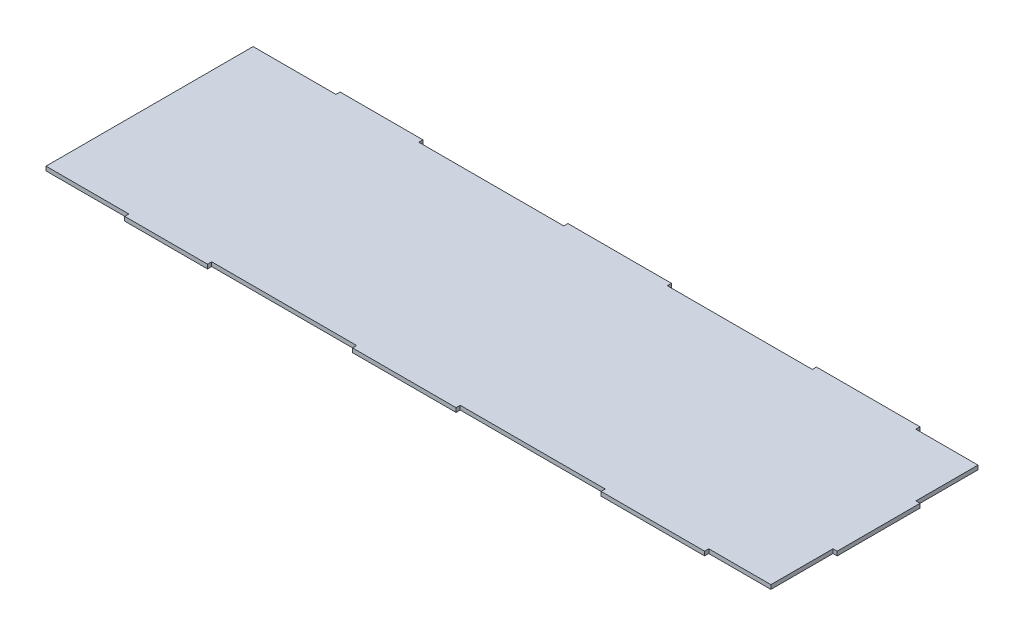
ISO-10303-21;
HEADER;
FILE_DESCRIPTION(('STEP AP214'),'2;1');
FILE_NAME('part.step','',(''),(''),'','','');
FILE_SCHEMA(('AUTOMOTIVE_DESIGN { 1 0 10303 214 1 1 1 1 }'));
ENDSEC;
DATA;
#1=APPLICATION_CONTEXT('core data for automotive mechanical design processes');
#2=APPLICATION_PROTOCOL_DEFINITION('international standard','automotive_design',2000,#1);
#3=PRODUCT_CONTEXT('',#1,'mechanical');
#4=PRODUCT('Part','Part','',(#3));
#5=PRODUCT_RELATED_PRODUCT_CATEGORY('part','',(#4));
#6=PRODUCT_DEFINITION_FORMATION('','',#4);
#7=PRODUCT_DEFINITION_CONTEXT('part definition',#1,'design');
#8=PRODUCT_DEFINITION('design','',#6,#7);
#9=PRODUCT_DEFINITION_SHAPE('','',#8);
#10=(LENGTH_UNIT() NAMED_UNIT(*) SI_UNIT(.MILLI.,.METRE.));
#11=(NAMED_UNIT(*) PLANE_ANGLE_UNIT() SI_UNIT($,.RADIAN.));
#12=(NAMED_UNIT(*) SI_UNIT($,.STERADIAN.) SOLID_ANGLE_UNIT());
#13=UNCERTAINTY_MEASURE_WITH_UNIT(LENGTH_MEASURE(1.E-05),#10,'distance_accuracy_value','');
#14=(GEOMETRIC_REPRESENTATION_CONTEXT(3) GLOBAL_UNCERTAINTY_ASSIGNED_CONTEXT((#13)) GLOBAL_UNIT_ASSIGNED_CONTEXT((#10,
#11,#12)) REPRESENTATION_CONTEXT('',''));
#15=CARTESIAN_POINT('',(0.,0.,0.));
#16=DIRECTION('',(0.,0.,1.));
#17=DIRECTION('',(1.,0.,0.));
#18=AXIS2_PLACEMENT_3D('',#15,#16,#17);
#19=CARTESIAN_POINT('',(350.,2.,0.));
#20=DIRECTION('',(1.,0.,0.));
#21=DIRECTION('',(0.,0.,-1.));
#22=AXIS2_PLACEMENT_3D('',#19,#20,#21);
#23=PLANE('',#22);
#24=DIRECTION('',(0.,0.,1.));
#25=VECTOR('',#24,1.);
#26=CARTESIAN_POINT('',(350.,2.,0.));
#27=LINE('',#26,#25);
#28=CARTESIAN_POINT('',(350.,2.,-50.));
#29=VERTEX_POINT('',#28);
#30=CARTESIAN_POINT('',(350.,2.,-20.));
#31=VERTEX_POINT('',#30);
#32=EDGE_CURVE('E508',#29,#31,#27,.T.);
#33=ORIENTED_EDGE('',*,*,#32,.T.);
#34=DIRECTION('',(0.,-1.,0.));
#35=VECTOR('',#34,1.);
#36=CARTESIAN_POINT('',(350.,2.,-20.));
#37=LINE('',#36,#35);
#38=CARTESIAN_POINT('',(350.,0.,-20.));
#39=VERTEX_POINT('',#38);
#40=EDGE_CURVE('E507',#31,#39,#37,.T.);
#41=ORIENTED_EDGE('',*,*,#40,.T.);
#42=DIRECTION('',(0.,0.,1.));
#43=VECTOR('',#42,1.);
#44=CARTESIAN_POINT('',(350.,0.,0.));
#45=LINE('',#44,#43);
#46=CARTESIAN_POINT('',(350.,0.,-50.));
#47=VERTEX_POINT('',#46);
#48=EDGE_CURVE('E361',#47,#39,#45,.T.);
#49=ORIENTED_EDGE('',*,*,#48,.F.);
#50=DIRECTION('',(0.,-1.,0.));
#51=VECTOR('',#50,1.);
#52=CARTESIAN_POINT('',(350.,2.,-50.));
#53=LINE('',#52,#51);
#54=EDGE_CURVE('E409',#29,#47,#53,.T.);
#55=ORIENTED_EDGE('',*,*,#54,.F.);
#56=EDGE_LOOP('',(#33,#41,#49,#55));
#57=FACE_BOUND('',#56,.T.);
#58=ADVANCED_FACE('F68',(#57),#23,.T.);
#59=CARTESIAN_POINT('',(80.,2.,0.));
#60=DIRECTION('',(1.,0.,0.));
#61=DIRECTION('',(0.,0.,-1.));
#62=AXIS2_PLACEMENT_3D('',#59,#60,#61);
#63=PLANE('',#62);
#64=DIRECTION('',(0.,0.,1.));
#65=VECTOR('',#64,1.);
#66=CARTESIAN_POINT('',(80.,0.,0.));
#67=LINE('',#66,#65);
#68=CARTESIAN_POINT('',(80.,0.,-52.));
#69=VERTEX_POINT('',#68);
#70=CARTESIAN_POINT('',(80.,0.,-50.));
#71=VERTEX_POINT('',#70);
#72=EDGE_CURVE('E301',#69,#71,#67,.T.);
#73=ORIENTED_EDGE('',*,*,#72,.F.);
#74=DIRECTION('',(0.,-1.,0.));
#75=VECTOR('',#74,1.);
#76=CARTESIAN_POINT('',(80.,2.,-52.));
#77=LINE('',#76,#75);
#78=CARTESIAN_POINT('',(80.,2.,-52.));
#79=VERTEX_POINT('',#78);
#80=EDGE_CURVE('E12',#79,#69,#77,.T.);
#81=ORIENTED_EDGE('',*,*,#80,.F.);
#82=DIRECTION('',(0.,0.,1.));
#83=VECTOR('',#82,1.);
#84=CARTESIAN_POINT('',(80.,2.,0.));
#85=LINE('',#84,#83);
#86=CARTESIAN_POINT('',(80.,2.,-50.));
#87=VERTEX_POINT('',#86);
#88=EDGE_CURVE('E487',#79,#87,#85,.T.);
#89=ORIENTED_EDGE('',*,*,#88,.T.);
#90=DIRECTION('',(0.,-1.,0.));
#91=VECTOR('',#90,1.);
#92=CARTESIAN_POINT('',(80.,2.,-50.));
#93=LINE('',#92,#91);
#94=EDGE_CURVE('E93',#87,#71,#93,.T.);
#95=ORIENTED_EDGE('',*,*,#94,.T.);
#96=EDGE_LOOP('',(#73,#81,#89,#95));
#97=FACE_BOUND('',#96,.T.);
#98=ADVANCED_FACE('F70',(#97),#63,.T.);
#99=CARTESIAN_POINT('',(0.,2.,-52.));
#100=DIRECTION('',(0.,0.,-1.));
#101=DIRECTION('',(-1.,0.,0.));
#102=AXIS2_PLACEMENT_3D('',#99,#100,#101);
#103=PLANE('',#102);
#104=DIRECTION('',(1.,0.,0.));
#105=VECTOR('',#104,1.);
#106=CARTESIAN_POINT('',(0.,0.,-52.));
#107=LINE('',#106,#105);
#108=CARTESIAN_POINT('',(40.,0.,-52.));
#109=VERTEX_POINT('',#108);
#110=EDGE_CURVE('E304',#109,#69,#107,.T.);
#111=ORIENTED_EDGE('',*,*,#110,.F.);
#112=DIRECTION('',(0.,-1.,0.));
#113=VECTOR('',#112,1.);
#114=CARTESIAN_POINT('',(40.,2.,-52.));
#115=LINE('',#114,#113);
#116=CARTESIAN_POINT('',(40.,2.,-52.));
#117=VERTEX_POINT('',#116);
#118=EDGE_CURVE('E77',#117,#109,#115,.T.);
#119=ORIENTED_EDGE('',*,*,#118,.F.);
#120=DIRECTION('',(1.,0.,0.));
#121=VECTOR('',#120,1.);
#122=CARTESIAN_POINT('',(0.,2.,-52.));
#123=LINE('',#122,#121);
#124=EDGE_CURVE('E483',#117,#79,#123,.T.);
#125=ORIENTED_EDGE('',*,*,#124,.T.);
#126=ORIENTED_EDGE('',*,*,#80,.T.);
#127=EDGE_LOOP('',(#111,#119,#125,#126));
#128=FACE_BOUND('',#127,.T.);
#129=ADVANCED_FACE('F482',(#128),#103,.T.);
#130=CARTESIAN_POINT('',(40.,2.,0.));
#131=DIRECTION('',(1.,0.,0.));
#132=DIRECTION('',(0.,0.,-1.));
#133=AXIS2_PLACEMENT_3D('',#130,#131,#132);
#134=PLANE('',#133);
#135=DIRECTION('',(0.,0.,1.));
#136=VECTOR('',#135,1.);
#137=CARTESIAN_POINT('',(40.,0.,0.));
#138=LINE('',#137,#136);
#139=CARTESIAN_POINT('',(40.,0.,-50.));
#140=VERTEX_POINT('',#139);
#141=EDGE_CURVE('E309',#109,#140,#138,.T.);
#142=ORIENTED_EDGE('',*,*,#141,.T.);
#143=DIRECTION('',(0.,-1.,0.));
#144=VECTOR('',#143,1.);
#145=CARTESIAN_POINT('',(40.,2.,-50.));
#146=LINE('',#145,#144);
#147=CARTESIAN_POINT('',(40.,2.,-50.));
#148=VERTEX_POINT('',#147);
#149=EDGE_CURVE('E465',#148,#140,#146,.T.);
#150=ORIENTED_EDGE('',*,*,#149,.F.);
#151=DIRECTION('',(0.,0.,1.));
#152=VECTOR('',#151,1.);
#153=CARTESIAN_POINT('',(40.,2.,0.));
#154=LINE('',#153,#152);
#155=EDGE_CURVE('E473',#117,#148,#154,.T.);
#156=ORIENTED_EDGE('',*,*,#155,.F.);
#157=ORIENTED_EDGE('',*,*,#118,.T.);
#158=EDGE_LOOP('',(#142,#150,#156,#157));
#159=FACE_BOUND('',#158,.T.);
#160=ADVANCED_FACE('F471',(#159),#134,.F.);
#161=CARTESIAN_POINT('',(0.,2.,-50.));
#162=DIRECTION('',(0.,0.,-1.));
#163=DIRECTION('',(-1.,0.,0.));
#164=AXIS2_PLACEMENT_3D('',#161,#162,#163);
#165=PLANE('',#164);
#166=DIRECTION('',(1.,0.,0.));
#167=VECTOR('',#166,1.);
#168=CARTESIAN_POINT('',(0.,0.,-50.));
#169=LINE('',#168,#167);
#170=CARTESIAN_POINT('',(0.,0.,-50.));
#171=VERTEX_POINT('',#170);
#172=EDGE_CURVE('E313',#171,#140,#169,.T.);
#173=ORIENTED_EDGE('',*,*,#172,.F.);
#174=DIRECTION('',(0.,-1.,0.));
#175=VECTOR('',#174,1.);
#176=CARTESIAN_POINT('',(0.,2.,-50.));
#177=LINE('',#176,#175);
#178=CARTESIAN_POINT('',(0.,2.,-50.));
#179=VERTEX_POINT('',#178);
#180=EDGE_CURVE('E462',#179,#171,#177,.T.);
#181=ORIENTED_EDGE('',*,*,#180,.F.);
#182=DIRECTION('',(1.,0.,0.));
#183=VECTOR('',#182,1.);
#184=CARTESIAN_POINT('',(0.,2.,-50.));
#185=LINE('',#184,#183);
#186=EDGE_CURVE('E534',#179,#148,#185,.T.);
#187=ORIENTED_EDGE('',*,*,#186,.T.);
#188=ORIENTED_EDGE('',*,*,#149,.T.);
#189=EDGE_LOOP('',(#173,#181,#187,#188));
#190=FACE_BOUND('',#189,.T.);
#191=ADVANCED_FACE('F599',(#190),#165,.T.);
#192=CARTESIAN_POINT('',(0.,2.,0.));
#193=DIRECTION('',(1.,0.,0.));
#194=DIRECTION('',(0.,0.,-1.));
#195=AXIS2_PLACEMENT_3D('',#192,#193,#194);
#196=PLANE('',#195);
#197=DIRECTION('',(0.,0.,1.));
#198=VECTOR('',#197,1.);
#199=CARTESIAN_POINT('',(0.,0.,0.));
#200=LINE('',#199,#198);
#201=CARTESIAN_POINT('',(0.,0.,50.));
#202=VERTEX_POINT('',#201);
#203=EDGE_CURVE('E317',#171,#202,#200,.T.);
#204=ORIENTED_EDGE('',*,*,#203,.T.);
#205=DIRECTION('',(0.,-1.,0.));
#206=VECTOR('',#205,1.);
#207=CARTESIAN_POINT('',(0.,2.,50.));
#208=LINE('',#207,#206);
#209=CARTESIAN_POINT('',(0.,2.,50.));
#210=VERTEX_POINT('',#209);
#211=EDGE_CURVE('E458',#210,#202,#208,.T.);
#212=ORIENTED_EDGE('',*,*,#211,.F.);
#213=DIRECTION('',(0.,0.,1.));
#214=VECTOR('',#213,1.);
#215=CARTESIAN_POINT('',(0.,2.,0.));
#216=LINE('',#215,#214);
#217=EDGE_CURVE('E538',#179,#210,#216,.T.);
#218=ORIENTED_EDGE('',*,*,#217,.F.);
#219=ORIENTED_EDGE('',*,*,#180,.T.);
#220=EDGE_LOOP('',(#204,#212,#218,#219));
#221=FACE_BOUND('',#220,.T.);
#222=ADVANCED_FACE('F603',(#221),#196,.F.);
#223=CARTESIAN_POINT('',(0.,2.,50.));
#224=DIRECTION('',(0.,0.,-1.));
#225=DIRECTION('',(-1.,0.,0.));
#226=AXIS2_PLACEMENT_3D('',#223,#224,#225);
#227=PLANE('',#226);
#228=DIRECTION('',(1.,0.,0.));
#229=VECTOR('',#228,1.);
#230=CARTESIAN_POINT('',(0.,0.,50.));
#231=LINE('',#230,#229);
#232=CARTESIAN_POINT('',(40.,0.,50.));
#233=VERTEX_POINT('',#232);
#234=EDGE_CURVE('E322',#202,#233,#231,.T.);
#235=ORIENTED_EDGE('',*,*,#234,.T.);
#236=DIRECTION('',(0.,-1.,0.));
#237=VECTOR('',#236,1.);
#238=CARTESIAN_POINT('',(40.,2.,50.));
#239=LINE('',#238,#237);
#240=CARTESIAN_POINT('',(40.,2.,50.));
#241=VERTEX_POINT('',#240);
#242=EDGE_CURVE('E454',#241,#233,#239,.T.);
#243=ORIENTED_EDGE('',*,*,#242,.F.);
#244=DIRECTION('',(1.,0.,0.));
#245=VECTOR('',#244,1.);
#246=CARTESIAN_POINT('',(0.,2.,50.));
#247=LINE('',#246,#245);
#248=EDGE_CURVE('E541',#210,#241,#247,.T.);
#249=ORIENTED_EDGE('',*,*,#248,.F.);
#250=ORIENTED_EDGE('',*,*,#211,.T.);
#251=EDGE_LOOP('',(#235,#243,#249,#250));
#252=FACE_BOUND('',#251,.T.);
#253=ADVANCED_FACE('F609',(#252),#227,.F.);
#254=CARTESIAN_POINT('',(40.,2.,0.));
#255=DIRECTION('',(1.,0.,0.));
#256=DIRECTION('',(0.,0.,-1.));
#257=AXIS2_PLACEMENT_3D('',#254,#255,#256);
#258=PLANE('',#257);
#259=DIRECTION('',(0.,0.,1.));
#260=VECTOR('',#259,1.);
#261=CARTESIAN_POINT('',(40.,0.,0.));
#262=LINE('',#261,#260);
#263=CARTESIAN_POINT('',(40.,0.,52.));
#264=VERTEX_POINT('',#263);
#265=EDGE_CURVE('E325',#233,#264,#262,.T.);
#266=ORIENTED_EDGE('',*,*,#265,.T.);
#267=DIRECTION('',(0.,-1.,0.));
#268=VECTOR('',#267,1.);
#269=CARTESIAN_POINT('',(40.,2.,52.));
#270=LINE('',#269,#268);
#271=CARTESIAN_POINT('',(40.,2.,52.));
#272=VERTEX_POINT('',#271);
#273=EDGE_CURVE('E450',#272,#264,#270,.T.);
#274=ORIENTED_EDGE('',*,*,#273,.F.);
#275=DIRECTION('',(0.,0.,1.));
#276=VECTOR('',#275,1.);
#277=CARTESIAN_POINT('',(40.,2.,0.));
#278=LINE('',#277,#276);
#279=EDGE_CURVE('E544',#241,#272,#278,.T.);
#280=ORIENTED_EDGE('',*,*,#279,.F.);
#281=ORIENTED_EDGE('',*,*,#242,.T.);
#282=EDGE_LOOP('',(#266,#274,#280,#281));
#283=FACE_BOUND('',#282,.T.);
#284=ADVANCED_FACE('F613',(#283),#258,.F.);
#285=CARTESIAN_POINT('',(0.,2.,52.));
#286=DIRECTION('',(0.,0.,-1.));
#287=DIRECTION('',(-1.,0.,0.));
#288=AXIS2_PLACEMENT_3D('',#285,#286,#287);
#289=PLANE('',#288);
#290=DIRECTION('',(1.,0.,0.));
#291=VECTOR('',#290,1.);
#292=CARTESIAN_POINT('',(0.,0.,52.));
#293=LINE('',#292,#291);
#294=CARTESIAN_POINT('',(80.,0.,52.));
#295=VERTEX_POINT('',#294);
#296=EDGE_CURVE('E330',#264,#295,#293,.T.);
#297=ORIENTED_EDGE('',*,*,#296,.T.);
#298=DIRECTION('',(0.,-1.,0.));
#299=VECTOR('',#298,1.);
#300=CARTESIAN_POINT('',(80.,2.,52.));
#301=LINE('',#300,#299);
#302=CARTESIAN_POINT('',(80.,2.,52.));
#303=VERTEX_POINT('',#302);
#304=EDGE_CURVE('E447',#303,#295,#301,.T.);
#305=ORIENTED_EDGE('',*,*,#304,.F.);
#306=DIRECTION('',(1.,0.,0.));
#307=VECTOR('',#306,1.);
#308=CARTESIAN_POINT('',(0.,2.,52.));
#309=LINE('',#308,#307);
#310=EDGE_CURVE('E549',#272,#303,#309,.T.);
#311=ORIENTED_EDGE('',*,*,#310,.F.);
#312=ORIENTED_EDGE('',*,*,#273,.T.);
#313=EDGE_LOOP('',(#297,#305,#311,#312));
#314=FACE_BOUND('',#313,.T.);
#315=ADVANCED_FACE('F618',(#314),#289,.F.);
#316=CARTESIAN_POINT('',(80.0000000000004,2.,5.5511151231258E-13));
#317=DIRECTION('',(1.,0.,0.));
#318=DIRECTION('',(0.,0.,-1.));
#319=AXIS2_PLACEMENT_3D('',#316,#317,#318);
#320=PLANE('',#319);
#321=DIRECTION('',(0.,0.,1.));
#322=VECTOR('',#321,1.);
#323=CARTESIAN_POINT('',(80.0000000000004,0.,5.5511151231258E-13));
#324=LINE('',#323,#322);
#325=CARTESIAN_POINT('',(80.,0.,50.));
#326=VERTEX_POINT('',#325);
#327=EDGE_CURVE('E334',#326,#295,#324,.T.);
#328=ORIENTED_EDGE('',*,*,#327,.F.);
#329=DIRECTION('',(0.,-1.,0.));
#330=VECTOR('',#329,1.);
#331=CARTESIAN_POINT('',(80.,2.,50.));
#332=LINE('',#331,#330);
#333=CARTESIAN_POINT('',(80.,2.,50.));
#334=VERTEX_POINT('',#333);
#335=EDGE_CURVE('E444',#334,#326,#332,.T.);
#336=ORIENTED_EDGE('',*,*,#335,.F.);
#337=DIRECTION('',(0.,0.,1.));
#338=VECTOR('',#337,1.);
#339=CARTESIAN_POINT('',(80.0000000000004,2.,5.5511151231258E-13));
#340=LINE('',#339,#338);
#341=EDGE_CURVE('E552',#334,#303,#340,.T.);
#342=ORIENTED_EDGE('',*,*,#341,.T.);
#343=ORIENTED_EDGE('',*,*,#304,.T.);
#344=EDGE_LOOP('',(#328,#336,#342,#343));
#345=FACE_BOUND('',#344,.T.);
#346=ADVANCED_FACE('F624',(#345),#320,.T.);
#347=CARTESIAN_POINT('',(150.,0.,50.));
#348=VERTEX_POINT('',#347);
#349=EDGE_CURVE('E327',#326,#348,#231,.T.);
#350=ORIENTED_EDGE('',*,*,#349,.T.);
#351=DIRECTION('',(0.,-1.,0.));
#352=VECTOR('',#351,1.);
#353=CARTESIAN_POINT('',(150.,2.,50.));
#354=LINE('',#353,#352);
#355=CARTESIAN_POINT('',(150.,2.,50.));
#356=VERTEX_POINT('',#355);
#357=EDGE_CURVE('E440',#356,#348,#354,.T.);
#358=ORIENTED_EDGE('',*,*,#357,.F.);
#359=EDGE_CURVE('E546',#334,#356,#247,.T.);
#360=ORIENTED_EDGE('',*,*,#359,.F.);
#361=ORIENTED_EDGE('',*,*,#335,.T.);
#362=EDGE_LOOP('',(#350,#358,#360,#361));
#363=FACE_BOUND('',#362,.T.);
#364=ADVANCED_FACE('F627',(#363),#227,.F.);
#365=CARTESIAN_POINT('',(150.,2.,0.));
#366=DIRECTION('',(1.,0.,0.));
#367=DIRECTION('',(0.,0.,-1.));
#368=AXIS2_PLACEMENT_3D('',#365,#366,#367);
#369=PLANE('',#368);
#370=DIRECTION('',(0.,0.,1.));
#371=VECTOR('',#370,1.);
#372=CARTESIAN_POINT('',(150.,0.,0.));
#373=LINE('',#372,#371);
#374=CARTESIAN_POINT('',(150.,0.,52.));
#375=VERTEX_POINT('',#374);
#376=EDGE_CURVE('E338',#348,#375,#373,.T.);
#377=ORIENTED_EDGE('',*,*,#376,.T.);
#378=DIRECTION('',(0.,-1.,0.));
#379=VECTOR('',#378,1.);
#380=CARTESIAN_POINT('',(150.,2.,52.));
#381=LINE('',#380,#379);
#382=CARTESIAN_POINT('',(150.,2.,52.));
#383=VERTEX_POINT('',#382);
#384=EDGE_CURVE('E436',#383,#375,#381,.T.);
#385=ORIENTED_EDGE('',*,*,#384,.F.);
#386=DIRECTION('',(0.,0.,1.));
#387=VECTOR('',#386,1.);
#388=CARTESIAN_POINT('',(150.,2.,0.));
#389=LINE('',#388,#387);
#390=EDGE_CURVE('E556',#356,#383,#389,.T.);
#391=ORIENTED_EDGE('',*,*,#390,.F.);
#392=ORIENTED_EDGE('',*,*,#357,.T.);
#393=EDGE_LOOP('',(#377,#385,#391,#392));
#394=FACE_BOUND('',#393,.T.);
#395=ADVANCED_FACE('F692',(#394),#369,.F.);
#396=CARTESIAN_POINT('',(0.,2.,52.));
#397=DIRECTION('',(0.,0.,-1.));
#398=DIRECTION('',(-1.,0.,0.));
#399=AXIS2_PLACEMENT_3D('',#396,#397,#398);
#400=PLANE('',#399);
#401=DIRECTION('',(1.,0.,0.));
#402=VECTOR('',#401,1.);
#403=CARTESIAN_POINT('',(0.,0.,52.));
#404=LINE('',#403,#402);
#405=CARTESIAN_POINT('',(200.,0.,52.));
#406=VERTEX_POINT('',#405);
#407=EDGE_CURVE('E341',#375,#406,#404,.T.);
#408=ORIENTED_EDGE('',*,*,#407,.T.);
#409=DIRECTION('',(0.,-1.,0.));
#410=VECTOR('',#409,1.);
#411=CARTESIAN_POINT('',(200.,2.,52.));
#412=LINE('',#411,#410);
#413=CARTESIAN_POINT('',(200.,2.,52.));
#414=VERTEX_POINT('',#413);
#415=EDGE_CURVE('E433',#414,#406,#412,.T.);
#416=ORIENTED_EDGE('',*,*,#415,.F.);
#417=DIRECTION('',(1.,0.,0.));
#418=VECTOR('',#417,1.);
#419=CARTESIAN_POINT('',(0.,2.,52.));
#420=LINE('',#419,#418);
#421=EDGE_CURVE('E559',#383,#414,#420,.T.);
#422=ORIENTED_EDGE('',*,*,#421,.F.);
#423=ORIENTED_EDGE('',*,*,#384,.T.);
#424=EDGE_LOOP('',(#408,#416,#422,#423));
#425=FACE_BOUND('',#424,.T.);
#426=ADVANCED_FACE('F698',(#425),#400,.F.);
#427=CARTESIAN_POINT('',(200.,2.,0.));
#428=DIRECTION('',(1.,0.,0.));
#429=DIRECTION('',(0.,0.,-1.));
#430=AXIS2_PLACEMENT_3D('',#427,#428,#429);
#431=PLANE('',#430);
#432=DIRECTION('',(0.,0.,1.));
#433=VECTOR('',#432,1.);
#434=CARTESIAN_POINT('',(200.,0.,0.));
#435=LINE('',#434,#433);
#436=CARTESIAN_POINT('',(200.,0.,50.));
#437=VERTEX_POINT('',#436);
#438=EDGE_CURVE('E345',#437,#406,#435,.T.);
#439=ORIENTED_EDGE('',*,*,#438,.F.);
#440=DIRECTION('',(0.,-1.,0.));
#441=VECTOR('',#440,1.);
#442=CARTESIAN_POINT('',(200.,2.,50.));
#443=LINE('',#442,#441);
#444=CARTESIAN_POINT('',(200.,2.,50.));
#445=VERTEX_POINT('',#444);
#446=EDGE_CURVE('E430',#445,#437,#443,.T.);
#447=ORIENTED_EDGE('',*,*,#446,.F.);
#448=DIRECTION('',(0.,0.,1.));
#449=VECTOR('',#448,1.);
#450=CARTESIAN_POINT('',(200.,2.,0.));
#451=LINE('',#450,#449);
#452=EDGE_CURVE('E562',#445,#414,#451,.T.);
#453=ORIENTED_EDGE('',*,*,#452,.T.);
#454=ORIENTED_EDGE('',*,*,#415,.T.);
#455=EDGE_LOOP('',(#439,#447,#453,#454));
#456=FACE_BOUND('',#455,.T.);
#457=ADVANCED_FACE('F701',(#456),#431,.T.);
#458=CARTESIAN_POINT('',(270.,0.,50.));
#459=VERTEX_POINT('',#458);
#460=EDGE_CURVE('E349',#437,#459,#231,.T.);
#461=ORIENTED_EDGE('',*,*,#460,.T.);
#462=DIRECTION('',(0.,-1.,0.));
#463=VECTOR('',#462,1.);
#464=CARTESIAN_POINT('',(270.,2.,50.));
#465=LINE('',#464,#463);
#466=CARTESIAN_POINT('',(270.,2.,50.));
#467=VERTEX_POINT('',#466);
#468=EDGE_CURVE('E426',#467,#459,#465,.T.);
#469=ORIENTED_EDGE('',*,*,#468,.F.);
#470=EDGE_CURVE('E566',#445,#467,#247,.T.);
#471=ORIENTED_EDGE('',*,*,#470,.F.);
#472=ORIENTED_EDGE('',*,*,#446,.T.);
#473=EDGE_LOOP('',(#461,#469,#471,#472));
#474=FACE_BOUND('',#473,.T.);
#475=ADVANCED_FACE('F702',(#474),#227,.F.);
#476=CARTESIAN_POINT('',(270.,2.,0.));
#477=DIRECTION('',(1.,0.,0.));
#478=DIRECTION('',(0.,0.,-1.));
#479=AXIS2_PLACEMENT_3D('',#476,#477,#478);
#480=PLANE('',#479);
#481=DIRECTION('',(0.,0.,1.));
#482=VECTOR('',#481,1.);
#483=CARTESIAN_POINT('',(270.,0.,0.));
#484=LINE('',#483,#482);
#485=CARTESIAN_POINT('',(270.,0.,52.));
#486=VERTEX_POINT('',#485);
#487=EDGE_CURVE('E350',#459,#486,#484,.T.);
#488=ORIENTED_EDGE('',*,*,#487,.T.);
#489=DIRECTION('',(0.,-1.,0.));
#490=VECTOR('',#489,1.);
#491=CARTESIAN_POINT('',(270.,2.,52.));
#492=LINE('',#491,#490);
#493=CARTESIAN_POINT('',(270.,2.,52.));
#494=VERTEX_POINT('',#493);
#495=EDGE_CURVE('E422',#494,#486,#492,.T.);
#496=ORIENTED_EDGE('',*,*,#495,.F.);
#497=DIRECTION('',(0.,0.,1.));
#498=VECTOR('',#497,1.);
#499=CARTESIAN_POINT('',(270.,2.,0.));
#500=LINE('',#499,#498);
#501=EDGE_CURVE('E567',#467,#494,#500,.T.);
#502=ORIENTED_EDGE('',*,*,#501,.F.);
#503=ORIENTED_EDGE('',*,*,#468,.T.);
#504=EDGE_LOOP('',(#488,#496,#502,#503));
#505=FACE_BOUND('',#504,.T.);
#506=ADVANCED_FACE('F707',(#505),#480,.F.);
#507=CARTESIAN_POINT('',(0.,2.,52.));
#508=DIRECTION('',(0.,0.,-1.));
#509=DIRECTION('',(-1.,0.,0.));
#510=AXIS2_PLACEMENT_3D('',#507,#508,#509);
#511=PLANE('',#510);
#512=DIRECTION('',(1.,0.,0.));
#513=VECTOR('',#512,1.);
#514=CARTESIAN_POINT('',(0.,0.,52.));
#515=LINE('',#514,#513);
#516=CARTESIAN_POINT('',(320.,0.,52.));
#517=VERTEX_POINT('',#516);
#518=EDGE_CURVE('E353',#486,#517,#515,.T.);
#519=ORIENTED_EDGE('',*,*,#518,.T.);
#520=DIRECTION('',(0.,-1.,0.));
#521=VECTOR('',#520,1.);
#522=CARTESIAN_POINT('',(320.,2.,52.));
#523=LINE('',#522,#521);
#524=CARTESIAN_POINT('',(320.,2.,52.));
#525=VERTEX_POINT('',#524);
#526=EDGE_CURVE('E419',#525,#517,#523,.T.);
#527=ORIENTED_EDGE('',*,*,#526,.F.);
#528=DIRECTION('',(1.,0.,0.));
#529=VECTOR('',#528,1.);
#530=CARTESIAN_POINT('',(0.,2.,52.));
#531=LINE('',#530,#529);
#532=EDGE_CURVE('E570',#494,#525,#531,.T.);
#533=ORIENTED_EDGE('',*,*,#532,.F.);
#534=ORIENTED_EDGE('',*,*,#495,.T.);
#535=EDGE_LOOP('',(#519,#527,#533,#534));
#536=FACE_BOUND('',#535,.T.);
#537=ADVANCED_FACE('F711',(#536),#511,.F.);
#538=CARTESIAN_POINT('',(320.,2.,0.));
#539=DIRECTION('',(1.,0.,0.));
#540=DIRECTION('',(0.,0.,-1.));
#541=AXIS2_PLACEMENT_3D('',#538,#539,#540);
#542=PLANE('',#541);
#543=DIRECTION('',(0.,0.,1.));
#544=VECTOR('',#543,1.);
#545=CARTESIAN_POINT('',(320.,0.,0.));
#546=LINE('',#545,#544);
#547=CARTESIAN_POINT('',(320.,0.,49.9999999999999));
#548=VERTEX_POINT('',#547);
#549=EDGE_CURVE('E357',#548,#517,#546,.T.);
#550=ORIENTED_EDGE('',*,*,#549,.F.);
#551=DIRECTION('',(0.,-1.,0.));
#552=VECTOR('',#551,1.);
#553=CARTESIAN_POINT('',(320.,2.,49.9999999999999));
#554=LINE('',#553,#552);
#555=CARTESIAN_POINT('',(320.,2.,49.9999999999999));
#556=VERTEX_POINT('',#555);
#557=EDGE_CURVE('E416',#556,#548,#554,.T.);
#558=ORIENTED_EDGE('',*,*,#557,.F.);
#559=DIRECTION('',(0.,0.,1.));
#560=VECTOR('',#559,1.);
#561=CARTESIAN_POINT('',(320.,2.,0.));
#562=LINE('',#561,#560);
#563=EDGE_CURVE('E573',#556,#525,#562,.T.);
#564=ORIENTED_EDGE('',*,*,#563,.T.);
#565=ORIENTED_EDGE('',*,*,#526,.T.);
#566=EDGE_LOOP('',(#550,#558,#564,#565));
#567=FACE_BOUND('',#566,.T.);
#568=ADVANCED_FACE('F714',(#567),#542,.T.);
#569=CARTESIAN_POINT('',(350.,0.,49.9999999999999));
#570=VERTEX_POINT('',#569);
#571=EDGE_CURVE('E326',#548,#570,#231,.T.);
#572=ORIENTED_EDGE('',*,*,#571,.T.);
#573=DIRECTION('',(0.,-1.,0.));
#574=VECTOR('',#573,1.);
#575=CARTESIAN_POINT('',(350.,2.,49.9999999999999));
#576=LINE('',#575,#574);
#577=CARTESIAN_POINT('',(350.,2.,49.9999999999999));
#578=VERTEX_POINT('',#577);
#579=EDGE_CURVE('E412',#578,#570,#576,.T.);
#580=ORIENTED_EDGE('',*,*,#579,.F.);
#581=EDGE_CURVE('E545',#556,#578,#247,.T.);
#582=ORIENTED_EDGE('',*,*,#581,.F.);
#583=ORIENTED_EDGE('',*,*,#557,.T.);
#584=EDGE_LOOP('',(#572,#580,#582,#583));
#585=FACE_BOUND('',#584,.T.);
#586=ADVANCED_FACE('F715',(#585),#227,.F.);
#587=DIRECTION('',(0.,-1.,0.));
#588=VECTOR('',#587,1.);
#589=CARTESIAN_POINT('',(350.,2.,20.));
#590=LINE('',#589,#588);
#591=CARTESIAN_POINT('',(350.,2.,20.));
#592=VERTEX_POINT('',#591);
#593=CARTESIAN_POINT('',(350.,0.,20.));
#594=VERTEX_POINT('',#593);
#595=EDGE_CURVE('E305',#592,#594,#590,.T.);
#596=ORIENTED_EDGE('',*,*,#595,.F.);
#597=EDGE_CURVE('E579',#592,#578,#27,.T.);
#598=ORIENTED_EDGE('',*,*,#597,.T.);
#599=ORIENTED_EDGE('',*,*,#579,.T.);
#600=EDGE_CURVE('E365',#594,#570,#45,.T.);
#601=ORIENTED_EDGE('',*,*,#600,.F.);
#602=EDGE_LOOP('',(#596,#598,#599,#601));
#603=FACE_BOUND('',#602,.T.);
#604=ADVANCED_FACE('F643',(#603),#23,.T.);
#605=CARTESIAN_POINT('',(320.,0.,-50.));
#606=VERTEX_POINT('',#605);
#607=EDGE_CURVE('E319',#606,#47,#169,.T.);
#608=ORIENTED_EDGE('',*,*,#607,.F.);
#609=DIRECTION('',(0.,-1.,0.));
#610=VECTOR('',#609,1.);
#611=CARTESIAN_POINT('',(320.,2.,-50.));
#612=LINE('',#611,#610);
#613=CARTESIAN_POINT('',(320.,2.,-50.));
#614=VERTEX_POINT('',#613);
#615=EDGE_CURVE('E406',#614,#606,#612,.T.);
#616=ORIENTED_EDGE('',*,*,#615,.F.);
#617=EDGE_CURVE('E503',#614,#29,#185,.T.);
#618=ORIENTED_EDGE('',*,*,#617,.T.);
#619=ORIENTED_EDGE('',*,*,#54,.T.);
#620=EDGE_LOOP('',(#608,#616,#618,#619));
#621=FACE_BOUND('',#620,.T.);
#622=ADVANCED_FACE('F500',(#621),#165,.T.);
#623=CARTESIAN_POINT('',(320.,2.,0.));
#624=DIRECTION('',(1.,0.,0.));
#625=DIRECTION('',(0.,0.,-1.));
#626=AXIS2_PLACEMENT_3D('',#623,#624,#625);
#627=PLANE('',#626);
#628=DIRECTION('',(0.,0.,1.));
#629=VECTOR('',#628,1.);
#630=CARTESIAN_POINT('',(320.,0.,0.));
#631=LINE('',#630,#629);
#632=CARTESIAN_POINT('',(320.,0.,-52.));
#633=VERTEX_POINT('',#632);
#634=EDGE_CURVE('E366',#633,#606,#631,.T.);
#635=ORIENTED_EDGE('',*,*,#634,.F.);
#636=DIRECTION('',(0.,-1.,0.));
#637=VECTOR('',#636,1.);
#638=CARTESIAN_POINT('',(320.,2.,-52.));
#639=LINE('',#638,#637);
#640=CARTESIAN_POINT('',(320.,2.,-52.));
#641=VERTEX_POINT('',#640);
#642=EDGE_CURVE('E403',#641,#633,#639,.T.);
#643=ORIENTED_EDGE('',*,*,#642,.F.);
#644=DIRECTION('',(0.,0.,1.));
#645=VECTOR('',#644,1.);
#646=CARTESIAN_POINT('',(320.,2.,0.));
#647=LINE('',#646,#645);
#648=EDGE_CURVE('E580',#641,#614,#647,.T.);
#649=ORIENTED_EDGE('',*,*,#648,.T.);
#650=ORIENTED_EDGE('',*,*,#615,.T.);
#651=EDGE_LOOP('',(#635,#643,#649,#650));
#652=FACE_BOUND('',#651,.T.);
#653=ADVANCED_FACE('F733',(#652),#627,.T.);
#654=CARTESIAN_POINT('',(0.,2.,-52.));
#655=DIRECTION('',(0.,0.,-1.));
#656=DIRECTION('',(-1.,0.,0.));
#657=AXIS2_PLACEMENT_3D('',#654,#655,#656);
#658=PLANE('',#657);
#659=DIRECTION('',(1.,0.,0.));
#660=VECTOR('',#659,1.);
#661=CARTESIAN_POINT('',(0.,0.,-52.));
#662=LINE('',#661,#660);
#663=CARTESIAN_POINT('',(270.,0.,-52.));
#664=VERTEX_POINT('',#663);
#665=EDGE_CURVE('E370',#664,#633,#662,.T.);
#666=ORIENTED_EDGE('',*,*,#665,.F.);
#667=DIRECTION('',(0.,-1.,0.));
#668=VECTOR('',#667,1.);
#669=CARTESIAN_POINT('',(270.,2.,-52.));
#670=LINE('',#669,#668);
#671=CARTESIAN_POINT('',(270.,2.,-52.));
#672=VERTEX_POINT('',#671);
#673=EDGE_CURVE('E400',#672,#664,#670,.T.);
#674=ORIENTED_EDGE('',*,*,#673,.F.);
#675=DIRECTION('',(1.,0.,0.));
#676=VECTOR('',#675,1.);
#677=CARTESIAN_POINT('',(0.,2.,-52.));
#678=LINE('',#677,#676);
#679=EDGE_CURVE('E584',#672,#641,#678,.T.);
#680=ORIENTED_EDGE('',*,*,#679,.T.);
#681=ORIENTED_EDGE('',*,*,#642,.T.);
#682=EDGE_LOOP('',(#666,#674,#680,#681));
#683=FACE_BOUND('',#682,.T.);
#684=ADVANCED_FACE('F736',(#683),#658,.T.);
#685=CARTESIAN_POINT('',(270.,2.,0.));
#686=DIRECTION('',(1.,0.,0.));
#687=DIRECTION('',(0.,0.,-1.));
#688=AXIS2_PLACEMENT_3D('',#685,#686,#687);
#689=PLANE('',#688);
#690=DIRECTION('',(0.,0.,1.));
#691=VECTOR('',#690,1.);
#692=CARTESIAN_POINT('',(270.,0.,0.));
#693=LINE('',#692,#691);
#694=CARTESIAN_POINT('',(270.,0.,-50.));
#695=VERTEX_POINT('',#694);
#696=EDGE_CURVE('E374',#664,#695,#693,.T.);
#697=ORIENTED_EDGE('',*,*,#696,.T.);
#698=DIRECTION('',(0.,-1.,0.));
#699=VECTOR('',#698,1.);
#700=CARTESIAN_POINT('',(270.,2.,-50.));
#701=LINE('',#700,#699);
#702=CARTESIAN_POINT('',(270.,2.,-50.));
#703=VERTEX_POINT('',#702);
#704=EDGE_CURVE('E397',#703,#695,#701,.T.);
#705=ORIENTED_EDGE('',*,*,#704,.F.);
#706=DIRECTION('',(0.,0.,1.));
#707=VECTOR('',#706,1.);
#708=CARTESIAN_POINT('',(270.,2.,0.));
#709=LINE('',#708,#707);
#710=EDGE_CURVE('E587',#672,#703,#709,.T.);
#711=ORIENTED_EDGE('',*,*,#710,.F.);
#712=ORIENTED_EDGE('',*,*,#673,.T.);
#713=EDGE_LOOP('',(#697,#705,#711,#712));
#714=FACE_BOUND('',#713,.T.);
#715=ADVANCED_FACE('F740',(#714),#689,.F.);
#716=CARTESIAN_POINT('',(200.,0.,-50.));
#717=VERTEX_POINT('',#716);
#718=EDGE_CURVE('E378',#717,#695,#169,.T.);
#719=ORIENTED_EDGE('',*,*,#718,.F.);
#720=DIRECTION('',(0.,-1.,0.));
#721=VECTOR('',#720,1.);
#722=CARTESIAN_POINT('',(200.,2.,-50.));
#723=LINE('',#722,#721);
#724=CARTESIAN_POINT('',(200.,2.,-50.));
#725=VERTEX_POINT('',#724);
#726=EDGE_CURVE('E394',#725,#717,#723,.T.);
#727=ORIENTED_EDGE('',*,*,#726,.F.);
#728=EDGE_CURVE('E297',#725,#703,#185,.T.);
#729=ORIENTED_EDGE('',*,*,#728,.T.);
#730=ORIENTED_EDGE('',*,*,#704,.T.);
#731=EDGE_LOOP('',(#719,#727,#729,#730));
#732=FACE_BOUND('',#731,.T.);
#733=ADVANCED_FACE('F744',(#732),#165,.T.);
#734=CARTESIAN_POINT('',(200.,2.,0.));
#735=DIRECTION('',(1.,0.,0.));
#736=DIRECTION('',(0.,0.,-1.));
#737=AXIS2_PLACEMENT_3D('',#734,#735,#736);
#738=PLANE('',#737);
#739=DIRECTION('',(0.,0.,1.));
#740=VECTOR('',#739,1.);
#741=CARTESIAN_POINT('',(200.,0.,0.));
#742=LINE('',#741,#740);
#743=CARTESIAN_POINT('',(200.,0.,-52.));
#744=VERTEX_POINT('',#743);
#745=EDGE_CURVE('E379',#744,#717,#742,.T.);
#746=ORIENTED_EDGE('',*,*,#745,.F.);
#747=DIRECTION('',(0.,-1.,0.));
#748=VECTOR('',#747,1.);
#749=CARTESIAN_POINT('',(200.,2.,-52.));
#750=LINE('',#749,#748);
#751=CARTESIAN_POINT('',(200.,2.,-52.));
#752=VERTEX_POINT('',#751);
#753=EDGE_CURVE('E278',#752,#744,#750,.T.);
#754=ORIENTED_EDGE('',*,*,#753,.F.);
#755=DIRECTION('',(0.,0.,1.));
#756=VECTOR('',#755,1.);
#757=CARTESIAN_POINT('',(200.,2.,0.));
#758=LINE('',#757,#756);
#759=EDGE_CURVE('E293',#752,#725,#758,.T.);
#760=ORIENTED_EDGE('',*,*,#759,.T.);
#761=ORIENTED_EDGE('',*,*,#726,.T.);
#762=EDGE_LOOP('',(#746,#754,#760,#761));
#763=FACE_BOUND('',#762,.T.);
#764=ADVANCED_FACE('F746',(#763),#738,.T.);
#765=CARTESIAN_POINT('',(0.,2.,-52.));
#766=DIRECTION('',(0.,0.,-1.));
#767=DIRECTION('',(-1.,0.,0.));
#768=AXIS2_PLACEMENT_3D('',#765,#766,#767);
#769=PLANE('',#768);
#770=DIRECTION('',(1.,0.,0.));
#771=VECTOR('',#770,1.);
#772=CARTESIAN_POINT('',(0.,0.,-52.));
#773=LINE('',#772,#771);
#774=CARTESIAN_POINT('',(150.,0.,-52.));
#775=VERTEX_POINT('',#774);
#776=EDGE_CURVE('E273',#775,#744,#773,.T.);
#777=ORIENTED_EDGE('',*,*,#776,.F.);
#778=DIRECTION('',(0.,-1.,0.));
#779=VECTOR('',#778,1.);
#780=CARTESIAN_POINT('',(150.,2.,-52.));
#781=LINE('',#780,#779);
#782=CARTESIAN_POINT('',(150.,2.,-52.));
#783=VERTEX_POINT('',#782);
#784=EDGE_CURVE('E267',#783,#775,#781,.T.);
#785=ORIENTED_EDGE('',*,*,#784,.F.);
#786=DIRECTION('',(1.,0.,0.));
#787=VECTOR('',#786,1.);
#788=CARTESIAN_POINT('',(0.,2.,-52.));
#789=LINE('',#788,#787);
#790=EDGE_CURVE('E271',#783,#752,#789,.T.);
#791=ORIENTED_EDGE('',*,*,#790,.T.);
#792=ORIENTED_EDGE('',*,*,#753,.T.);
#793=EDGE_LOOP('',(#777,#785,#791,#792));
#794=FACE_BOUND('',#793,.T.);
#795=ADVANCED_FACE('F269',(#794),#769,.T.);
#796=CARTESIAN_POINT('',(150.,2.,0.));
#797=DIRECTION('',(1.,0.,0.));
#798=DIRECTION('',(0.,0.,-1.));
#799=AXIS2_PLACEMENT_3D('',#796,#797,#798);
#800=PLANE('',#799);
#801=DIRECTION('',(0.,0.,1.));
#802=VECTOR('',#801,1.);
#803=CARTESIAN_POINT('',(150.,0.,0.));
#804=LINE('',#803,#802);
#805=CARTESIAN_POINT('',(150.,0.,-50.));
#806=VERTEX_POINT('',#805);
#807=EDGE_CURVE('E385',#775,#806,#804,.T.);
#808=ORIENTED_EDGE('',*,*,#807,.T.);
#809=DIRECTION('',(0.,-1.,0.));
#810=VECTOR('',#809,1.);
#811=CARTESIAN_POINT('',(150.,2.,-50.));
#812=LINE('',#811,#810);
#813=CARTESIAN_POINT('',(150.,2.,-50.));
#814=VERTEX_POINT('',#813);
#815=EDGE_CURVE('E279',#814,#806,#812,.T.);
#816=ORIENTED_EDGE('',*,*,#815,.F.);
#817=DIRECTION('',(0.,0.,1.));
#818=VECTOR('',#817,1.);
#819=CARTESIAN_POINT('',(150.,2.,0.));
#820=LINE('',#819,#818);
#821=EDGE_CURVE('E282',#783,#814,#820,.T.);
#822=ORIENTED_EDGE('',*,*,#821,.F.);
#823=ORIENTED_EDGE('',*,*,#784,.T.);
#824=EDGE_LOOP('',(#808,#816,#822,#823));
#825=FACE_BOUND('',#824,.T.);
#826=ADVANCED_FACE('F283',(#825),#800,.F.);
#827=EDGE_CURVE('E318',#71,#806,#169,.T.);
#828=ORIENTED_EDGE('',*,*,#827,.F.);
#829=ORIENTED_EDGE('',*,*,#94,.F.);
#830=EDGE_CURVE('E287',#87,#814,#185,.T.);
#831=ORIENTED_EDGE('',*,*,#830,.T.);
#832=ORIENTED_EDGE('',*,*,#815,.T.);
#833=EDGE_LOOP('',(#828,#829,#831,#832));
#834=FACE_BOUND('',#833,.T.);
#835=ADVANCED_FACE('F485',(#834),#165,.T.);
#836=CARTESIAN_POINT('',(0.,2.,0.));
#837=DIRECTION('',(0.,1.,0.));
#838=DIRECTION('',(0.,0.,1.));
#839=AXIS2_PLACEMENT_3D('',#836,#837,#838);
#840=PLANE('',#839);
#841=ORIENTED_EDGE('',*,*,#88,.F.);
#842=ORIENTED_EDGE('',*,*,#124,.F.);
#843=ORIENTED_EDGE('',*,*,#155,.T.);
#844=ORIENTED_EDGE('',*,*,#186,.F.);
#845=ORIENTED_EDGE('',*,*,#217,.T.);
#846=ORIENTED_EDGE('',*,*,#248,.T.);
#847=ORIENTED_EDGE('',*,*,#279,.T.);
#848=ORIENTED_EDGE('',*,*,#310,.T.);
#849=ORIENTED_EDGE('',*,*,#341,.F.);
#850=ORIENTED_EDGE('',*,*,#359,.T.);
#851=ORIENTED_EDGE('',*,*,#390,.T.);
#852=ORIENTED_EDGE('',*,*,#421,.T.);
#853=ORIENTED_EDGE('',*,*,#452,.F.);
#854=ORIENTED_EDGE('',*,*,#470,.T.);
#855=ORIENTED_EDGE('',*,*,#501,.T.);
#856=ORIENTED_EDGE('',*,*,#532,.T.);
#857=ORIENTED_EDGE('',*,*,#563,.F.);
#858=ORIENTED_EDGE('',*,*,#581,.T.);
#859=ORIENTED_EDGE('',*,*,#597,.F.);
#860=DIRECTION('',(1.,0.,0.));
#861=VECTOR('',#860,1.);
#862=CARTESIAN_POINT('',(0.,2.,20.));
#863=LINE('',#862,#861);
#864=CARTESIAN_POINT('',(352.,2.,20.));
#865=VERTEX_POINT('',#864);
#866=EDGE_CURVE('E651',#592,#865,#863,.T.);
#867=ORIENTED_EDGE('',*,*,#866,.T.);
#868=DIRECTION('',(0.,0.,1.));
#869=VECTOR('',#868,1.);
#870=CARTESIAN_POINT('',(352.,2.,0.));
#871=LINE('',#870,#869);
#872=CARTESIAN_POINT('',(352.,2.,-20.));
#873=VERTEX_POINT('',#872);
#874=EDGE_CURVE('E519',#873,#865,#871,.T.);
#875=ORIENTED_EDGE('',*,*,#874,.F.);
#876=DIRECTION('',(1.,0.,0.));
#877=VECTOR('',#876,1.);
#878=CARTESIAN_POINT('',(0.,2.,-20.));
#879=LINE('',#878,#877);
#880=EDGE_CURVE('E513',#31,#873,#879,.T.);
#881=ORIENTED_EDGE('',*,*,#880,.F.);
#882=ORIENTED_EDGE('',*,*,#32,.F.);
#883=ORIENTED_EDGE('',*,*,#617,.F.);
#884=ORIENTED_EDGE('',*,*,#648,.F.);
#885=ORIENTED_EDGE('',*,*,#679,.F.);
#886=ORIENTED_EDGE('',*,*,#710,.T.);
#887=ORIENTED_EDGE('',*,*,#728,.F.);
#888=ORIENTED_EDGE('',*,*,#759,.F.);
#889=ORIENTED_EDGE('',*,*,#790,.F.);
#890=ORIENTED_EDGE('',*,*,#821,.T.);
#891=ORIENTED_EDGE('',*,*,#830,.F.);
#892=EDGE_LOOP('',(#841,#842,#843,#844,#845,#846,#847,#848,#849,#850,#851,#852,#853,#854,#855,
#856,#857,#858,#859,#867,#875,#881,#882,#883,#884,#885,#886,#887,#888,#889,#890,#891));
#893=FACE_BOUND('',#892,.T.);
#894=ADVANCED_FACE('F290',(#893),#840,.T.);
#895=CARTESIAN_POINT('',(0.,0.,0.));
#896=DIRECTION('',(0.,1.,0.));
#897=DIRECTION('',(0.,0.,1.));
#898=AXIS2_PLACEMENT_3D('',#895,#896,#897);
#899=PLANE('',#898);
#900=ORIENTED_EDGE('',*,*,#72,.T.);
#901=ORIENTED_EDGE('',*,*,#827,.T.);
#902=ORIENTED_EDGE('',*,*,#807,.F.);
#903=ORIENTED_EDGE('',*,*,#776,.T.);
#904=ORIENTED_EDGE('',*,*,#745,.T.);
#905=ORIENTED_EDGE('',*,*,#718,.T.);
#906=ORIENTED_EDGE('',*,*,#696,.F.);
#907=ORIENTED_EDGE('',*,*,#665,.T.);
#908=ORIENTED_EDGE('',*,*,#634,.T.);
#909=ORIENTED_EDGE('',*,*,#607,.T.);
#910=ORIENTED_EDGE('',*,*,#48,.T.);
#911=DIRECTION('',(1.,0.,0.));
#912=VECTOR('',#911,1.);
#913=CARTESIAN_POINT('',(0.,0.,-20.));
#914=LINE('',#913,#912);
#915=CARTESIAN_POINT('',(352.,0.,-20.));
#916=VERTEX_POINT('',#915);
#917=EDGE_CURVE('E84',#39,#916,#914,.T.);
#918=ORIENTED_EDGE('',*,*,#917,.T.);
#919=DIRECTION('',(0.,0.,1.));
#920=VECTOR('',#919,1.);
#921=CARTESIAN_POINT('',(352.,0.,0.));
#922=LINE('',#921,#920);
#923=CARTESIAN_POINT('',(352.,0.,20.));
#924=VERTEX_POINT('',#923);
#925=EDGE_CURVE('E670',#916,#924,#922,.T.);
#926=ORIENTED_EDGE('',*,*,#925,.T.);
#927=DIRECTION('',(1.,0.,0.));
#928=VECTOR('',#927,1.);
#929=CARTESIAN_POINT('',(0.,0.,20.));
#930=LINE('',#929,#928);
#931=EDGE_CURVE('E671',#594,#924,#930,.T.);
#932=ORIENTED_EDGE('',*,*,#931,.F.);
#933=ORIENTED_EDGE('',*,*,#600,.T.);
#934=ORIENTED_EDGE('',*,*,#571,.F.);
#935=ORIENTED_EDGE('',*,*,#549,.T.);
#936=ORIENTED_EDGE('',*,*,#518,.F.);
#937=ORIENTED_EDGE('',*,*,#487,.F.);
#938=ORIENTED_EDGE('',*,*,#460,.F.);
#939=ORIENTED_EDGE('',*,*,#438,.T.);
#940=ORIENTED_EDGE('',*,*,#407,.F.);
#941=ORIENTED_EDGE('',*,*,#376,.F.);
#942=ORIENTED_EDGE('',*,*,#349,.F.);
#943=ORIENTED_EDGE('',*,*,#327,.T.);
#944=ORIENTED_EDGE('',*,*,#296,.F.);
#945=ORIENTED_EDGE('',*,*,#265,.F.);
#946=ORIENTED_EDGE('',*,*,#234,.F.);
#947=ORIENTED_EDGE('',*,*,#203,.F.);
#948=ORIENTED_EDGE('',*,*,#172,.T.);
#949=ORIENTED_EDGE('',*,*,#141,.F.);
#950=ORIENTED_EDGE('',*,*,#110,.T.);
#951=EDGE_LOOP('',(#900,#901,#902,#903,#904,#905,#906,#907,#908,#909,#910,#918,#926,#932,#933,
#934,#935,#936,#937,#938,#939,#940,#941,#942,#943,#944,#945,#946,#947,#948,#949,#950));
#952=FACE_BOUND('',#951,.T.);
#953=ADVANCED_FACE('F479',(#952),#899,.F.);
#954=CARTESIAN_POINT('',(0.,2.,20.));
#955=DIRECTION('',(0.,0.,-1.));
#956=DIRECTION('',(-1.,0.,0.));
#957=AXIS2_PLACEMENT_3D('',#954,#955,#956);
#958=PLANE('',#957);
#959=ORIENTED_EDGE('',*,*,#931,.T.);
#960=DIRECTION('',(0.,-1.,0.));
#961=VECTOR('',#960,1.);
#962=CARTESIAN_POINT('',(352.,2.,20.));
#963=LINE('',#962,#961);
#964=EDGE_CURVE('E517',#865,#924,#963,.T.);
#965=ORIENTED_EDGE('',*,*,#964,.F.);
#966=ORIENTED_EDGE('',*,*,#866,.F.);
#967=ORIENTED_EDGE('',*,*,#595,.T.);
#968=EDGE_LOOP('',(#959,#965,#966,#967));
#969=FACE_BOUND('',#968,.T.);
#970=ADVANCED_FACE('F672',(#969),#958,.F.);
#971=CARTESIAN_POINT('',(0.,2.,-20.));
#972=DIRECTION('',(0.,0.,-1.));
#973=DIRECTION('',(-1.,0.,0.));
#974=AXIS2_PLACEMENT_3D('',#971,#972,#973);
#975=PLANE('',#974);
#976=ORIENTED_EDGE('',*,*,#917,.F.);
#977=ORIENTED_EDGE('',*,*,#40,.F.);
#978=ORIENTED_EDGE('',*,*,#880,.T.);
#979=DIRECTION('',(0.,-1.,0.));
#980=VECTOR('',#979,1.);
#981=CARTESIAN_POINT('',(352.,2.,-20.));
#982=LINE('',#981,#980);
#983=EDGE_CURVE('E512',#873,#916,#982,.T.);
#984=ORIENTED_EDGE('',*,*,#983,.T.);
#985=EDGE_LOOP('',(#976,#977,#978,#984));
#986=FACE_BOUND('',#985,.T.);
#987=ADVANCED_FACE('F762',(#986),#975,.T.);
#988=CARTESIAN_POINT('',(352.,2.,0.));
#989=DIRECTION('',(1.,0.,0.));
#990=DIRECTION('',(0.,0.,-1.));
#991=AXIS2_PLACEMENT_3D('',#988,#989,#990);
#992=PLANE('',#991);
#993=ORIENTED_EDGE('',*,*,#925,.F.);
#994=ORIENTED_EDGE('',*,*,#983,.F.);
#995=ORIENTED_EDGE('',*,*,#874,.T.);
#996=ORIENTED_EDGE('',*,*,#964,.T.);
#997=EDGE_LOOP('',(#993,#994,#995,#996));
#998=FACE_BOUND('',#997,.T.);
#999=ADVANCED_FACE('F668',(#998),#992,.T.);
#1000=CLOSED_SHELL('',(#58,#98,#129,#160,#191,#222,#253,#284,#315,#346,#364,#395,#426,#457,#475,
#506,#537,#568,#586,#604,#622,#653,#684,#715,#733,#764,#795,#826,#835,#894,#953,#970,#987,#999));
#1001=MANIFOLD_SOLID_BREP('B2',#1000);
#1002=ADVANCED_BREP_SHAPE_REPRESENTATION('',(#18,#1001),#14);
#1003=SHAPE_DEFINITION_REPRESENTATION(#9,#1002);
ENDSEC;
END-ISO-10303-21;
